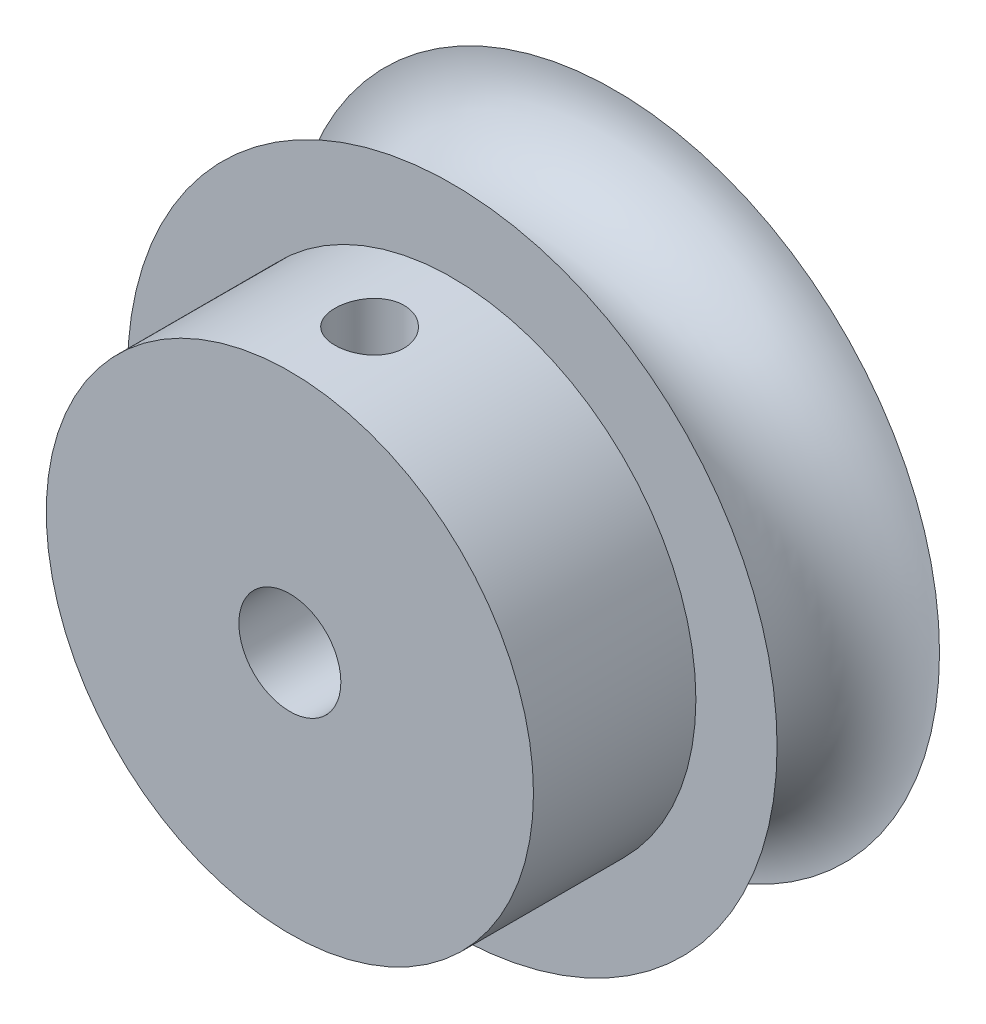
ISO-10303-21;
HEADER;
FILE_DESCRIPTION(('STEP AP214'),'2;1');
FILE_NAME('part.step','',(''),(''),'','','');
FILE_SCHEMA(('AUTOMOTIVE_DESIGN { 1 0 10303 214 1 1 1 1 }'));
ENDSEC;
DATA;
#1=APPLICATION_CONTEXT('core data for automotive mechanical design processes');
#2=APPLICATION_PROTOCOL_DEFINITION('international standard','automotive_design',2000,#1);
#3=PRODUCT_CONTEXT('',#1,'mechanical');
#4=PRODUCT('Part','Part','',(#3));
#5=PRODUCT_RELATED_PRODUCT_CATEGORY('part','',(#4));
#6=PRODUCT_DEFINITION_FORMATION('','',#4);
#7=PRODUCT_DEFINITION_CONTEXT('part definition',#1,'design');
#8=PRODUCT_DEFINITION('design','',#6,#7);
#9=PRODUCT_DEFINITION_SHAPE('','',#8);
#10=(LENGTH_UNIT() NAMED_UNIT(*) SI_UNIT(.MILLI.,.METRE.));
#11=(NAMED_UNIT(*) PLANE_ANGLE_UNIT() SI_UNIT($,.RADIAN.));
#12=(NAMED_UNIT(*) SI_UNIT($,.STERADIAN.) SOLID_ANGLE_UNIT());
#13=UNCERTAINTY_MEASURE_WITH_UNIT(LENGTH_MEASURE(1.E-05),#10,'distance_accuracy_value','');
#14=(GEOMETRIC_REPRESENTATION_CONTEXT(3) GLOBAL_UNCERTAINTY_ASSIGNED_CONTEXT((#13)) GLOBAL_UNIT_ASSIGNED_CONTEXT((#10,
#11,#12)) REPRESENTATION_CONTEXT('',''));
#15=CARTESIAN_POINT('',(0.,0.,0.));
#16=DIRECTION('',(0.,0.,1.));
#17=DIRECTION('',(1.,0.,0.));
#18=AXIS2_PLACEMENT_3D('',#15,#16,#17);
#19=CARTESIAN_POINT('',(0.,0.,6.35));
#20=DIRECTION('',(0.,0.,1.));
#21=DIRECTION('',(1.,0.,0.));
#22=AXIS2_PLACEMENT_3D('',#19,#20,#21);
#23=PLANE('',#22);
#24=CARTESIAN_POINT('',(0.,0.,6.35));
#25=DIRECTION('',(0.,0.,-1.));
#26=DIRECTION('',(-1.,0.,0.));
#27=AXIS2_PLACEMENT_3D('',#24,#25,#26);
#28=CIRCLE('',#27,12.7);
#29=CARTESIAN_POINT('',(-12.7,0.,6.35));
#30=VERTEX_POINT('',#29);
#31=EDGE_CURVE('E50',#30,#30,#28,.T.);
#32=ORIENTED_EDGE('',*,*,#31,.F.);
#33=EDGE_LOOP('',(#32));
#34=FACE_BOUND('',#33,.T.);
#35=CARTESIAN_POINT('',(0.,0.,6.35));
#36=DIRECTION('',(0.,0.,1.));
#37=DIRECTION('',(1.,0.,0.));
#38=AXIS2_PLACEMENT_3D('',#35,#36,#37);
#39=CIRCLE('',#38,9.525);
#40=CARTESIAN_POINT('',(9.525,0.,6.35));
#41=VERTEX_POINT('',#40);
#42=EDGE_CURVE('E38',#41,#41,#39,.T.);
#43=ORIENTED_EDGE('',*,*,#42,.F.);
#44=EDGE_LOOP('',(#43));
#45=FACE_BOUND('',#44,.T.);
#46=ADVANCED_FACE('F34',(#34,#45),#23,.T.);
#47=CARTESIAN_POINT('',(0.,0.,0.));
#48=DIRECTION('',(0.,0.,1.));
#49=DIRECTION('',(1.,0.,0.));
#50=AXIS2_PLACEMENT_3D('',#47,#48,#49);
#51=PLANE('',#50);
#52=CARTESIAN_POINT('',(0.,0.,0.));
#53=DIRECTION('',(0.,0.,1.));
#54=DIRECTION('',(1.,0.,0.));
#55=AXIS2_PLACEMENT_3D('',#52,#53,#54);
#56=CIRCLE('',#55,1.9939);
#57=CARTESIAN_POINT('',(1.9939,0.,0.));
#58=VERTEX_POINT('',#57);
#59=EDGE_CURVE('E45',#58,#58,#56,.T.);
#60=ORIENTED_EDGE('',*,*,#59,.T.);
#61=EDGE_LOOP('',(#60));
#62=FACE_BOUND('',#61,.T.);
#63=CARTESIAN_POINT('',(0.,0.,0.));
#64=DIRECTION('',(0.,0.,-1.));
#65=DIRECTION('',(-1.,0.,0.));
#66=AXIS2_PLACEMENT_3D('',#63,#64,#65);
#67=CIRCLE('',#66,12.7);
#68=CARTESIAN_POINT('',(-12.7,0.,0.));
#69=VERTEX_POINT('',#68);
#70=EDGE_CURVE('E55',#69,#69,#67,.T.);
#71=ORIENTED_EDGE('',*,*,#70,.T.);
#72=EDGE_LOOP('',(#71));
#73=FACE_BOUND('',#72,.T.);
#74=ADVANCED_FACE('F36',(#62,#73),#51,.F.);
#75=CARTESIAN_POINT('',(0.,0.,12.7));
#76=DIRECTION('',(0.,0.,-1.));
#77=DIRECTION('',(-1.,0.,0.));
#78=AXIS2_PLACEMENT_3D('',#75,#76,#77);
#79=CYLINDRICAL_SURFACE('',#78,9.525);
#80=CARTESIAN_POINT('',(-1.35255009270989,9.42847990116702,9.58400460400663));
#81=CARTESIAN_POINT('',(-1.35254693846715,9.42848111046918,9.5084433362623));
#82=CARTESIAN_POINT('',(-1.34619676177158,9.4293980626598,9.43283706135525));
#83=CARTESIAN_POINT('',(-1.32096869667658,9.4329646859939,9.28373507057906));
#84=CARTESIAN_POINT('',(-1.30207829311546,9.43561608808193,9.21024153975478));
#85=CARTESIAN_POINT('',(-1.25234347946995,9.44234538590909,9.0675450153106));
#86=CARTESIAN_POINT('',(-1.22150788275105,9.44642222971768,8.99833890192684));
#87=CARTESIAN_POINT('',(-1.14877814524653,9.45554179913665,8.86609405733709));
#88=CARTESIAN_POINT('',(-1.10688565122425,9.46058438088382,8.80305440964081));
#89=CARTESIAN_POINT('',(-1.01290948818475,9.47110779325562,8.68446808434494));
#90=CARTESIAN_POINT('',(-0.960762073230853,9.47659123135175,8.62897214880148));
#91=CARTESIAN_POINT('',(-0.847893886727079,9.48735518340646,8.5274878296197));
#92=CARTESIAN_POINT('',(-0.787172659682213,9.49263568656488,8.48149995142945));
#93=CARTESIAN_POINT('',(-0.658557318398418,9.50242590458439,8.400151567609));
#94=CARTESIAN_POINT('',(-0.590633526175638,9.50693221265855,8.36483753923889));
#95=CARTESIAN_POINT('',(-0.449744297325332,9.51463749086842,8.3061373511054));
#96=CARTESIAN_POINT('',(-0.376779100244347,9.51783652307055,8.2827506250483));
#97=CARTESIAN_POINT('',(-0.228399840892504,9.52254841884056,8.24872203840637));
#98=CARTESIAN_POINT('',(-0.153005588058797,9.52407249681117,8.23799537803051));
#99=CARTESIAN_POINT('',(-0.00147287604436829,9.52530115179799,8.22932827404425));
#100=CARTESIAN_POINT('',(0.0746655456718539,9.52500581994444,8.23138719003251));
#101=CARTESIAN_POINT('',(0.224947296219498,9.52263792940472,8.24816552162981));
#102=CARTESIAN_POINT('',(0.29910103970417,9.5205781761171,8.26279371725338));
#103=CARTESIAN_POINT('',(0.443890503746704,9.51492716435656,8.30415238152139));
#104=CARTESIAN_POINT('',(0.514526141490255,9.51133586985099,8.3308831349042));
#105=CARTESIAN_POINT('',(0.650552544834917,9.50300323893434,8.39578273450817));
#106=CARTESIAN_POINT('',(0.715924567373995,9.49825801542973,8.43399034590589));
#107=CARTESIAN_POINT('',(0.839363664351053,9.48814708187628,8.52073082264658));
#108=CARTESIAN_POINT('',(0.897430306921665,9.48278133518033,8.5692642979609));
#109=CARTESIAN_POINT('',(1.00514746449209,9.47197263737987,8.67578792675001));
#110=CARTESIAN_POINT('',(1.05471927051547,9.46652942267589,8.73385767759411));
#111=CARTESIAN_POINT('',(1.14342595646068,9.45622559782111,8.85753402667301));
#112=CARTESIAN_POINT('',(1.18256078410114,9.4513649905888,8.92314066265955));
#113=CARTESIAN_POINT('',(1.24929115517922,9.44277685690805,9.06010643690655));
#114=CARTESIAN_POINT('',(1.27687921633361,9.43905006559601,9.13146926956471));
#115=CARTESIAN_POINT('',(1.3196569492765,9.43316495943708,9.27787994404604));
#116=CARTESIAN_POINT('',(1.33484740003354,9.43100654604657,9.35292755403254));
#117=CARTESIAN_POINT('',(1.35229202792863,9.42852106412669,9.50387891627147));
#118=CARTESIAN_POINT('',(1.35465750546683,9.42817823977389,9.579769556007));
#119=CARTESIAN_POINT('',(1.34667980757659,9.42932097762504,9.73086408673779));
#120=CARTESIAN_POINT('',(1.33633698425126,9.43080648917211,9.80606799670179));
#121=CARTESIAN_POINT('',(1.30333044841799,9.43542407983107,9.95331333026075));
#122=CARTESIAN_POINT('',(1.28072165694148,9.43854881724156,10.0253673152453));
#123=CARTESIAN_POINT('',(1.22388189187727,9.44608676489324,10.1646625105313));
#124=CARTESIAN_POINT('',(1.18965039961865,9.45050003263472,10.2319035058877));
#125=CARTESIAN_POINT('',(1.11026741526152,9.46015511298294,10.3601644997131));
#126=CARTESIAN_POINT('',(1.06504355552116,9.46540233316635,10.4211392946103));
#127=CARTESIAN_POINT('',(0.965060750217577,9.47611757708666,10.5346735272422));
#128=CARTESIAN_POINT('',(0.910301323070151,9.48158561196488,10.5872325396887));
#129=CARTESIAN_POINT('',(0.792312969559355,9.49217533998935,10.6828400006298));
#130=CARTESIAN_POINT('',(0.729024148486467,9.49729415855077,10.7258148984773));
#131=CARTESIAN_POINT('',(0.596061256642967,9.50656462516135,10.8005229939891));
#132=CARTESIAN_POINT('',(0.52638734554406,9.51071629738671,10.8322564726708));
#133=CARTESIAN_POINT('',(0.382866680679764,9.51757204403391,10.883462069964));
#134=CARTESIAN_POINT('',(0.309034791443282,9.52028095300328,10.9029751769115));
#135=CARTESIAN_POINT('',(0.159101183858936,9.52396617596915,10.9293190277545));
#136=CARTESIAN_POINT('',(0.0829995994777576,9.52494259201949,10.9361505186715));
#137=CARTESIAN_POINT('',(-0.0685981949874705,9.52505197569194,10.9369204343478));
#138=CARTESIAN_POINT('',(-0.14409384487245,9.52420107556954,10.9309716878067));
#139=CARTESIAN_POINT('',(-0.293000135246534,9.52078379847999,10.9065908585486));
#140=CARTESIAN_POINT('',(-0.366410780462671,9.5182174254024,10.8881588041355));
#141=CARTESIAN_POINT('',(-0.509037658531628,9.51165619548858,10.839373087832));
#142=CARTESIAN_POINT('',(-0.578256329150211,9.50766217838441,10.809026433011));
#143=CARTESIAN_POINT('',(-0.710636955823986,9.49868555342592,10.7372848146385));
#144=CARTESIAN_POINT('',(-0.773798756689102,9.49370292025115,10.6958895681009));
#145=CARTESIAN_POINT('',(-0.892846527428031,9.4832513624238,10.6028144868393));
#146=CARTESIAN_POINT('',(-0.948666842800909,9.47777870059525,10.5510510894704));
#147=CARTESIAN_POINT('',(-1.05087076535073,9.4669923288291,10.4388846013012));
#148=CARTESIAN_POINT('',(-1.097252149489,9.46167865658719,10.3784794809107));
#149=CARTESIAN_POINT('',(-1.17946722793213,9.45178345308636,10.2503910808099));
#150=CARTESIAN_POINT('',(-1.21524697596167,9.44720571881809,10.1826728911631));
#151=CARTESIAN_POINT('',(-1.27487274150615,9.43934515269288,10.0421573740581));
#152=CARTESIAN_POINT('',(-1.2987313464289,9.43606095578301,9.9693654968211));
#153=CARTESIAN_POINT('',(-1.32832120877019,9.43193131708686,9.84419163801121));
#154=CARTESIAN_POINT('',(-1.33739342696784,9.43064375498016,9.79258874256621));
#155=CARTESIAN_POINT('',(-1.34950892834484,9.42891763283372,9.68866595953124));
#156=CARTESIAN_POINT('',(-1.35255227766159,9.42847906348045,9.63634607981301));
#157=CARTESIAN_POINT('',(-1.35255009270989,9.42847990116702,9.58400460400663));
#158=B_SPLINE_CURVE_WITH_KNOTS('',3,(#80,#81,#82,#83,#84,#85,#86,#87,#88,#89,#90,#91,#92,#93,
#94,#95,#96,#97,#98,#99,#100,#101,#102,#103,#104,#105,#106,#107,#108,#109,#110,#111,#112,#113,
#114,#115,#116,#117,#118,#119,#120,#121,#122,#123,#124,#125,#126,#127,#128,#129,#130,#131,#132,
#133,#134,#135,#136,#137,#138,#139,#140,#141,#142,#143,#144,#145,#146,#147,#148,#149,#150,#151,
#152,#153,#154,#155,#156,#157),.UNSPECIFIED.,.T.,.F.,(4,2,2,2,2,2,2,2,2,2,2,2,2,2,2,2,2,2,2,2,2,
2,2,2,2,2,2,2,2,2,2,2,2,2,2,2,2,2,4),(0.,0.226492525357348,0.453211431037403,0.679763377299386,
0.906281600979635,1.13425513351163,1.36224078199609,1.59120530524858,1.82015895653336,
2.04757016383838,2.27496998070947,2.50073327771484,2.72650188655724,2.95304181271712,
3.17959512480304,3.40814571525351,3.63669745054819,3.86539705850333,4.09408229566362,
4.32077969315946,4.54747080979546,4.77315519161292,4.9988496460733,5.22607222836521,
5.45330628963435,5.68222838295625,5.91114475319332,6.13928914424409,6.36742009582667,
6.59354530345003,6.81966999837115,7.04566190631614,7.27165960311529,7.49955787137885,
7.72750975183907,7.95660239137873,8.18545262054526,8.34234627046142,8.49923819922617),.UNSPECIFIED.);
#159=CARTESIAN_POINT('',(-1.35255009270989,9.42847990116702,9.58400460400663));
#160=VERTEX_POINT('',#159);
#161=EDGE_CURVE('E58',#160,#160,#158,.T.);
#162=ORIENTED_EDGE('',*,*,#161,.T.);
#163=EDGE_LOOP('',(#162));
#164=FACE_BOUND('',#163,.T.);
#165=CARTESIAN_POINT('',(0.,0.,12.7));
#166=DIRECTION('',(0.,0.,1.));
#167=DIRECTION('',(1.,0.,0.));
#168=AXIS2_PLACEMENT_3D('',#165,#166,#167);
#169=CIRCLE('',#168,9.525);
#170=CARTESIAN_POINT('',(9.525,0.,12.7));
#171=VERTEX_POINT('',#170);
#172=EDGE_CURVE('E10',#171,#171,#169,.T.);
#173=ORIENTED_EDGE('',*,*,#172,.F.);
#174=EDGE_LOOP('',(#173));
#175=FACE_BOUND('',#174,.T.);
#176=ORIENTED_EDGE('',*,*,#42,.T.);
#177=EDGE_LOOP('',(#176));
#178=FACE_BOUND('',#177,.T.);
#179=ADVANCED_FACE('F69',(#164,#175,#178),#79,.T.);
#180=CARTESIAN_POINT('',(0.,0.,12.7));
#181=DIRECTION('',(0.,0.,1.));
#182=DIRECTION('',(1.,0.,0.));
#183=AXIS2_PLACEMENT_3D('',#180,#181,#182);
#184=PLANE('',#183);
#185=CARTESIAN_POINT('',(0.,0.,12.7));
#186=DIRECTION('',(0.,0.,1.));
#187=DIRECTION('',(1.,0.,0.));
#188=AXIS2_PLACEMENT_3D('',#185,#186,#187);
#189=CIRCLE('',#188,1.9939);
#190=CARTESIAN_POINT('',(1.9939,0.,12.7));
#191=VERTEX_POINT('',#190);
#192=EDGE_CURVE('E47',#191,#191,#189,.T.);
#193=ORIENTED_EDGE('',*,*,#192,.F.);
#194=EDGE_LOOP('',(#193));
#195=FACE_BOUND('',#194,.T.);
#196=ORIENTED_EDGE('',*,*,#172,.T.);
#197=EDGE_LOOP('',(#196));
#198=FACE_BOUND('',#197,.T.);
#199=ADVANCED_FACE('F85',(#195,#198),#184,.T.);
#200=CARTESIAN_POINT('',(0.,0.,0.));
#201=DIRECTION('',(0.,0.,1.));
#202=DIRECTION('',(1.,0.,0.));
#203=AXIS2_PLACEMENT_3D('',#200,#201,#202);
#204=CYLINDRICAL_SURFACE('',#203,1.9939);
#205=CARTESIAN_POINT('',(-1.35255001440535,1.46500705408953,9.58400460400663));
#206=CARTESIAN_POINT('',(-1.35254786422592,1.4650109796921,9.64965784097565));
#207=CARTESIAN_POINT('',(-1.34772839578828,1.46950303014482,9.71532303123565));
#208=CARTESIAN_POINT('',(-1.32887858415097,1.48656257621896,9.844274358869));
#209=CARTESIAN_POINT('',(-1.31483115713387,1.49914504880708,9.90755585308421));
#210=CARTESIAN_POINT('',(-1.27866281110403,1.53010206558493,10.0294497532045));
#211=CARTESIAN_POINT('',(-1.2566239936474,1.54841745837817,10.0881025063179));
#212=CARTESIAN_POINT('',(-1.20533267585537,1.58867007583169,10.2007704403607));
#213=CARTESIAN_POINT('',(-1.17607899066913,1.61060789518378,10.2547848576001));
#214=CARTESIAN_POINT('',(-1.1056772464913,1.65989329282453,10.3662393883763));
#215=CARTESIAN_POINT('',(-1.06336957988305,1.68754119622034,10.4228142648841));
#216=CARTESIAN_POINT('',(-0.970402238256317,1.74266594692959,10.5288256068896));
#217=CARTESIAN_POINT('',(-0.919733168770179,1.77014256534276,10.5782539243071));
#218=CARTESIAN_POINT('',(-0.802204367779762,1.82673999727114,10.6760470659233));
#219=CARTESIAN_POINT('',(-0.73405422240404,1.85547512327232,10.723106363934));
#220=CARTESIAN_POINT('',(-0.588502849709938,1.90662425724604,10.8046505047498));
#221=CARTESIAN_POINT('',(-0.511119191282083,1.92905000552273,10.8391587377251));
#222=CARTESIAN_POINT('',(-0.370083408143319,1.96022630430656,10.8864896542483));
#223=CARTESIAN_POINT('',(-0.307975375953992,1.9710069844502,10.902600426873));
#224=CARTESIAN_POINT('',(-0.181388869587151,1.98665286614437,10.9258765402993));
#225=CARTESIAN_POINT('',(-0.116912251000103,1.99152260073534,10.9330487361123));
#226=CARTESIAN_POINT('',(0.0126807403892553,1.9949149877633,10.9380516329127));
#227=CARTESIAN_POINT('',(0.0777980072282001,1.99342694487566,10.9358665927441));
#228=CARTESIAN_POINT('',(0.206611278432927,1.98421811221352,10.9222499267763));
#229=CARTESIAN_POINT('',(0.270306860341363,1.97649549450511,10.9108155891454));
#230=CARTESIAN_POINT('',(0.39339902225618,1.95568513101995,10.8796088551783));
#231=CARTESIAN_POINT('',(0.452852789352122,1.94269771351914,10.859992192681));
#232=CARTESIAN_POINT('',(0.567527595945337,1.91234738493784,10.8132894164008));
#233=CARTESIAN_POINT('',(0.622747829002641,1.89498364290493,10.786201883998));
#234=CARTESIAN_POINT('',(0.734137452221882,1.85487648150349,10.7219944266947));
#235=CARTESIAN_POINT('',(0.789712217280176,1.83174728550085,10.6840878202812));
#236=CARTESIAN_POINT('',(0.894091883872306,1.78313204918013,10.6010821409103));
#237=CARTESIAN_POINT('',(0.942888831750822,1.75764329742171,10.5559747490977));
#238=CARTESIAN_POINT('',(1.04089217634445,1.70172616012039,10.4511388945323));
#239=CARTESIAN_POINT('',(1.08877714051609,1.67119026188967,10.3902276656144));
#240=CARTESIAN_POINT('',(1.17390028685922,1.612533189152,10.2602985677586));
#241=CARTESIAN_POINT('',(1.21114436131828,1.58441068431221,10.1912852152814));
#242=CARTESIAN_POINT('',(1.26628507415734,1.54048581107523,10.0631235166556));
#243=CARTESIAN_POINT('',(1.28667516914686,1.52334322913915,10.0055146104909));
#244=CARTESIAN_POINT('',(1.31966187771713,1.49486087612563,9.88676878310542));
#245=CARTESIAN_POINT('',(1.3322727417799,1.48351050115207,9.82563853854442));
#246=CARTESIAN_POINT('',(1.34898464053333,1.46833770853218,9.70073477345752));
#247=CARTESIAN_POINT('',(1.35301540017431,1.46457747048821,9.63694375511139));
#248=CARTESIAN_POINT('',(1.35199856365818,1.46551609379696,9.50949441740593));
#249=CARTESIAN_POINT('',(1.34695079028724,1.47021512027534,9.44583610066123));
#250=CARTESIAN_POINT('',(1.32927614617607,1.48619537450723,9.32793635282558));
#251=CARTESIAN_POINT('',(1.31756296165409,1.4966791292096,9.27343960075061));
#252=CARTESIAN_POINT('',(1.28793604437053,1.52224845807796,9.16728644893271));
#253=CARTESIAN_POINT('',(1.27001660848473,1.53733826337338,9.11563271250141));
#254=CARTESIAN_POINT('',(1.21918929390916,1.57819401263756,8.99312183125399));
#255=CARTESIAN_POINT('',(1.18316757559037,1.60570284972298,8.92413608573595));
#256=CARTESIAN_POINT('',(1.10056525410452,1.66341220258143,8.79400061881887));
#257=CARTESIAN_POINT('',(1.05396509948547,1.6936176387846,8.73286573945967));
#258=CARTESIAN_POINT('',(0.950260847512339,1.75393627039995,8.61837567044771));
#259=CARTESIAN_POINT('',(0.893020024836241,1.78404237556081,8.56514014647163));
#260=CARTESIAN_POINT('',(0.769198369522965,1.84081333086514,8.46871912480568));
#261=CARTESIAN_POINT('',(0.702632574494006,1.86748359134737,8.4255177382863));
#262=CARTESIAN_POINT('',(0.57374162967759,1.91055682834202,8.3574056311748));
#263=CARTESIAN_POINT('',(0.51274206292011,1.92794115878362,8.33061236804643));
#264=CARTESIAN_POINT('',(0.386269211031499,1.95720074116361,8.28605509853526));
#265=CARTESIAN_POINT('',(0.320798822541297,1.96907952200815,8.26828530765396));
#266=CARTESIAN_POINT('',(0.186748747487053,1.9862895338555,8.24266509252516));
#267=CARTESIAN_POINT('',(0.118155726337417,1.99158928186766,8.23486235904278));
#268=CARTESIAN_POINT('',(-0.0195943794128028,1.99499252499018,8.2298430065106));
#269=CARTESIAN_POINT('',(-0.0887513460041653,1.99309748895705,8.23262422668611));
#270=CARTESIAN_POINT('',(-0.219769560743883,1.9827536572149,8.24793076727075));
#271=CARTESIAN_POINT('',(-0.281770686658573,1.97484341628741,8.25965560106113));
#272=CARTESIAN_POINT('',(-0.402699462952109,1.95377586474141,8.29128144936965));
#273=CARTESIAN_POINT('',(-0.461626623178592,1.94061772020444,8.31118376334598));
#274=CARTESIAN_POINT('',(-0.578152854207059,1.90924159831644,8.35953993863592));
#275=CARTESIAN_POINT('',(-0.635530008138715,1.89079933108021,8.38837897473261));
#276=CARTESIAN_POINT('',(-0.744776500983661,1.85049760807362,8.45319088137425));
#277=CARTESIAN_POINT('',(-0.796642880428819,1.82863633160398,8.4891675556292));
#278=CARTESIAN_POINT('',(-0.90209699348988,1.77925830798244,8.57362247598525));
#279=CARTESIAN_POINT('',(-0.954658667704573,1.75139401900717,8.62317809712256));
#280=CARTESIAN_POINT('',(-1.05121103624234,1.69520366397518,8.7298785254713));
#281=CARTESIAN_POINT('',(-1.0951942157987,1.66687721639323,8.78702991355567));
#282=CARTESIAN_POINT('',(-1.17202031325217,1.61371611393418,8.90540599646362));
#283=CARTESIAN_POINT('',(-1.20529886766793,1.58877886935617,8.96630038620698));
#284=CARTESIAN_POINT('',(-1.26257438174829,1.54365635780927,9.09393274408309));
#285=CARTESIAN_POINT('',(-1.28658651449305,1.52346334390988,9.16066093810205));
#286=CARTESIAN_POINT('',(-1.3207430081734,1.49388626668548,9.2865401563529));
#287=CARTESIAN_POINT('',(-1.3325985366517,1.48321562219856,9.34491498120996));
#288=CARTESIAN_POINT('',(-1.34849773526328,1.46877889113464,9.46352647368049));
#289=CARTESIAN_POINT('',(-1.35255198743252,1.46500345191551,9.52376050645443));
#290=CARTESIAN_POINT('',(-1.35255001440535,1.46500705408953,9.58400460400663));
#291=B_SPLINE_CURVE_WITH_KNOTS('',3,(#205,#206,#207,#208,#209,#210,#211,#212,#213,#214,#215,
#216,#217,#218,#219,#220,#221,#222,#223,#224,#225,#226,#227,#228,#229,#230,#231,#232,#233,#234,
#235,#236,#237,#238,#239,#240,#241,#242,#243,#244,#245,#246,#247,#248,#249,#250,#251,#252,#253,
#254,#255,#256,#257,#258,#259,#260,#261,#262,#263,#264,#265,#266,#267,#268,#269,#270,#271,#272,
#273,#274,#275,#276,#277,#278,#279,#280,#281,#282,#283,#284,#285,#286,#287,#288,#289,#290),
.UNSPECIFIED.,.T.,.F.,(4,2,2,2,2,2,2,2,2,2,2,2,2,2,2,2,2,2,2,2,2,2,2,2,2,2,2,2,2,2,2,2,2,2,2,2,
2,2,2,2,2,2,4),(0.,0.196682721731863,0.393730594332839,0.588808886996179,0.783919237456651,
1.01067411026029,1.23768551051025,1.49922920677406,1.76028296196337,1.95462863582231,
2.14882517372199,2.34334852583732,2.53792893156616,2.72896366955775,2.9200347075365,
3.13264322213393,3.3454991586871,3.5942872257528,3.84293726068856,4.03264596954688,
4.22200611801933,4.41291133971385,4.60382028793729,4.77331438266075,4.94296464604174,
5.18928618176103,5.43606673908551,5.68627015424859,5.93607463500249,6.14178366177541,
6.34736065173703,6.55391765448439,6.76043248970065,6.95036212044478,7.14032194400142,
7.3399933734504,7.53977149676421,7.77115867113867,8.00274763930762,8.22314515326459,
8.44318023563322,8.62390367559902,8.80438180008873),.UNSPECIFIED.);
#292=CARTESIAN_POINT('',(-1.35255001440535,1.46500705408953,9.58400460400663));
#293=VERTEX_POINT('',#292);
#294=EDGE_CURVE('E65',#293,#293,#291,.T.);
#295=ORIENTED_EDGE('',*,*,#294,.T.);
#296=EDGE_LOOP('',(#295));
#297=FACE_BOUND('',#296,.T.);
#298=ORIENTED_EDGE('',*,*,#59,.F.);
#299=EDGE_LOOP('',(#298));
#300=FACE_BOUND('',#299,.T.);
#301=ORIENTED_EDGE('',*,*,#192,.T.);
#302=EDGE_LOOP('',(#301));
#303=FACE_BOUND('',#302,.T.);
#304=ADVANCED_FACE('F82',(#297,#300,#303),#204,.F.);
#305=CARTESIAN_POINT('',(0.,0.,3.175));
#306=DIRECTION('',(0.,0.,-1.));
#307=DIRECTION('',(-1.,0.,0.));
#308=AXIS2_PLACEMENT_3D('',#305,#306,#307);
#309=TOROIDAL_SURFACE('',#308,12.7,3.175);
#310=ORIENTED_EDGE('',*,*,#31,.T.);
#311=EDGE_LOOP('',(#310));
#312=FACE_BOUND('',#311,.T.);
#313=ORIENTED_EDGE('',*,*,#70,.F.);
#314=EDGE_LOOP('',(#313));
#315=FACE_BOUND('',#314,.T.);
#316=ADVANCED_FACE('F75',(#312,#315),#309,.F.);
#317=CARTESIAN_POINT('',(-9.36589770240009E-08,9.525,9.58400460400663));
#318=DIRECTION('',(-9.8329633936891E-09,1.,0.));
#319=DIRECTION('',(-1.,-9.8329633936891E-09,0.));
#320=AXIS2_PLACEMENT_3D('',#317,#318,#319);
#321=CYLINDRICAL_SURFACE('',#320,1.35254999999999);
#322=ORIENTED_EDGE('',*,*,#294,.F.);
#323=EDGE_LOOP('',(#322));
#324=FACE_BOUND('',#323,.T.);
#325=ORIENTED_EDGE('',*,*,#161,.F.);
#326=EDGE_LOOP('',(#325));
#327=FACE_BOUND('',#326,.T.);
#328=ADVANCED_FACE('F72',(#324,#327),#321,.F.);
#329=CLOSED_SHELL('',(#46,#74,#179,#199,#304,#316,#328));
#330=MANIFOLD_SOLID_BREP('B2',#329);
#331=ADVANCED_BREP_SHAPE_REPRESENTATION('',(#18,#330),#14);
#332=SHAPE_DEFINITION_REPRESENTATION(#9,#331);
ENDSEC;
END-ISO-10303-21;
